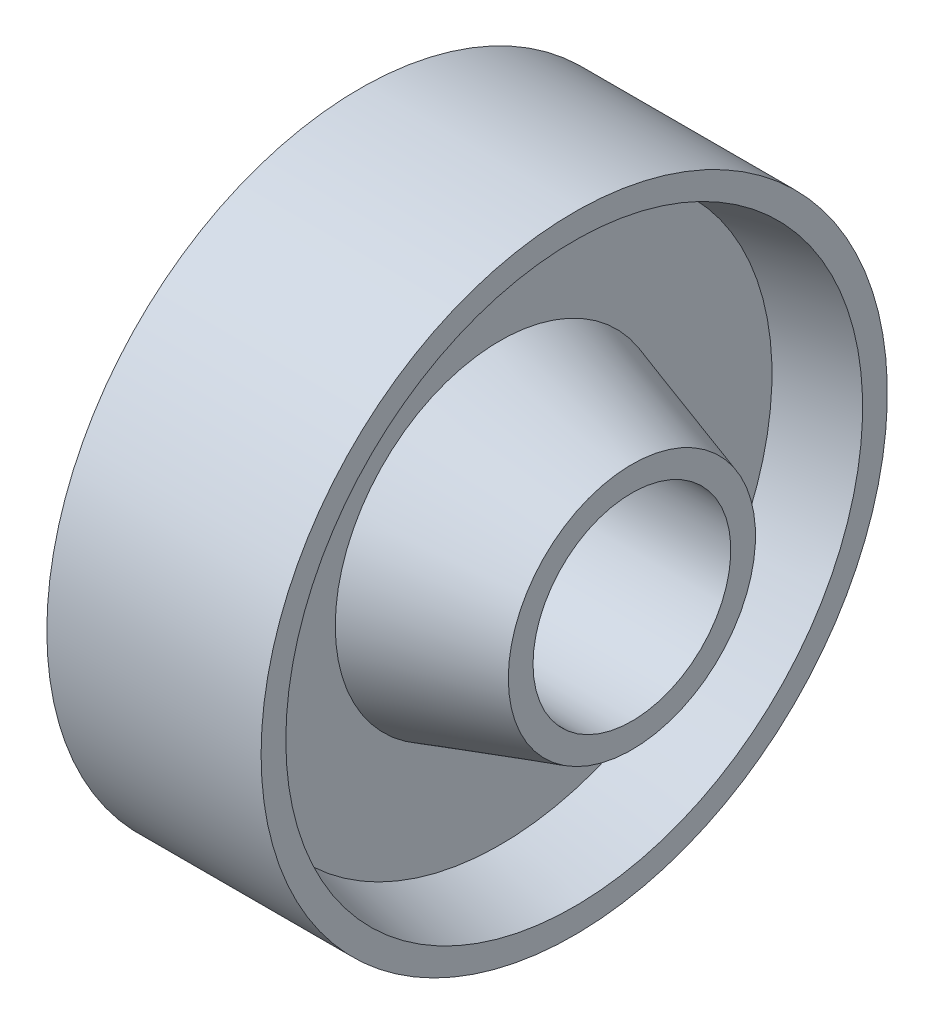
ISO-10303-21;
HEADER;
FILE_DESCRIPTION(('STEP AP214'),'2;1');
FILE_NAME('part.step','',(''),(''),'','','');
FILE_SCHEMA(('AUTOMOTIVE_DESIGN { 1 0 10303 214 1 1 1 1 }'));
ENDSEC;
DATA;
#1=APPLICATION_CONTEXT('core data for automotive mechanical design processes');
#2=APPLICATION_PROTOCOL_DEFINITION('international standard','automotive_design',2000,#1);
#3=PRODUCT_CONTEXT('',#1,'mechanical');
#4=PRODUCT('Part','Part','',(#3));
#5=PRODUCT_RELATED_PRODUCT_CATEGORY('part','',(#4));
#6=PRODUCT_DEFINITION_FORMATION('','',#4);
#7=PRODUCT_DEFINITION_CONTEXT('part definition',#1,'design');
#8=PRODUCT_DEFINITION('design','',#6,#7);
#9=PRODUCT_DEFINITION_SHAPE('','',#8);
#10=(LENGTH_UNIT() NAMED_UNIT(*) SI_UNIT(.MILLI.,.METRE.));
#11=(NAMED_UNIT(*) PLANE_ANGLE_UNIT() SI_UNIT($,.RADIAN.));
#12=(NAMED_UNIT(*) SI_UNIT($,.STERADIAN.) SOLID_ANGLE_UNIT());
#13=UNCERTAINTY_MEASURE_WITH_UNIT(LENGTH_MEASURE(1.E-05),#10,'distance_accuracy_value','');
#14=(GEOMETRIC_REPRESENTATION_CONTEXT(3) GLOBAL_UNCERTAINTY_ASSIGNED_CONTEXT((#13)) GLOBAL_UNIT_ASSIGNED_CONTEXT((#10,
#11,#12)) REPRESENTATION_CONTEXT('',''));
#15=CARTESIAN_POINT('',(0.,0.,0.));
#16=DIRECTION('',(0.,0.,1.));
#17=DIRECTION('',(1.,0.,0.));
#18=AXIS2_PLACEMENT_3D('',#15,#16,#17);
#19=CARTESIAN_POINT('',(-13.,38.,0.));
#20=DIRECTION('',(1.,0.,0.));
#21=DIRECTION('',(0.,0.,-1.));
#22=AXIS2_PLACEMENT_3D('',#19,#20,#21);
#23=PLANE('',#22);
#24=CARTESIAN_POINT('',(-13.,0.,0.));
#25=DIRECTION('',(-1.,0.,0.));
#26=DIRECTION('',(0.,0.,1.));
#27=AXIS2_PLACEMENT_3D('',#24,#25,#26);
#28=CIRCLE('',#27,35.);
#29=CARTESIAN_POINT('',(-13.,0.,35.));
#30=VERTEX_POINT('',#29);
#31=EDGE_CURVE('E12',#30,#30,#28,.T.);
#32=ORIENTED_EDGE('',*,*,#31,.F.);
#33=EDGE_LOOP('',(#32));
#34=FACE_BOUND('',#33,.T.);
#35=CARTESIAN_POINT('',(-13.,0.,0.));
#36=DIRECTION('',(-1.,0.,0.));
#37=DIRECTION('',(0.,0.,1.));
#38=AXIS2_PLACEMENT_3D('',#35,#36,#37);
#39=CIRCLE('',#38,38.);
#40=CARTESIAN_POINT('',(-13.,0.,38.));
#41=VERTEX_POINT('',#40);
#42=EDGE_CURVE('E91',#41,#41,#39,.T.);
#43=ORIENTED_EDGE('',*,*,#42,.T.);
#44=EDGE_LOOP('',(#43));
#45=FACE_BOUND('',#44,.T.);
#46=ADVANCED_FACE('F51',(#34,#45),#23,.F.);
#47=CARTESIAN_POINT('',(-13.,0.,0.));
#48=DIRECTION('',(-1.,0.,0.));
#49=DIRECTION('',(0.,0.,1.));
#50=AXIS2_PLACEMENT_3D('',#47,#48,#49);
#51=CONICAL_SURFACE('',#50,35.,0.218668945873942);
#52=CARTESIAN_POINT('',(-4.,0.,0.));
#53=DIRECTION('',(-1.,0.,0.));
#54=DIRECTION('',(0.,0.,1.));
#55=AXIS2_PLACEMENT_3D('',#52,#53,#54);
#56=CIRCLE('',#55,33.);
#57=CARTESIAN_POINT('',(-4.,0.,33.));
#58=VERTEX_POINT('',#57);
#59=EDGE_CURVE('E57',#58,#58,#56,.T.);
#60=ORIENTED_EDGE('',*,*,#59,.F.);
#61=EDGE_LOOP('',(#60));
#62=FACE_BOUND('',#61,.T.);
#63=ORIENTED_EDGE('',*,*,#31,.T.);
#64=EDGE_LOOP('',(#63));
#65=FACE_BOUND('',#64,.T.);
#66=ADVANCED_FACE('F152',(#62,#65),#51,.F.);
#67=CARTESIAN_POINT('',(-4.,33.,0.));
#68=DIRECTION('',(1.,0.,0.));
#69=DIRECTION('',(0.,0.,-1.));
#70=AXIS2_PLACEMENT_3D('',#67,#68,#69);
#71=PLANE('',#70);
#72=CARTESIAN_POINT('',(-4.,0.,0.));
#73=DIRECTION('',(-1.,0.,0.));
#74=DIRECTION('',(0.,0.,1.));
#75=AXIS2_PLACEMENT_3D('',#72,#73,#74);
#76=CIRCLE('',#75,20.);
#77=CARTESIAN_POINT('',(-4.,0.,20.));
#78=VERTEX_POINT('',#77);
#79=EDGE_CURVE('E61',#78,#78,#76,.T.);
#80=ORIENTED_EDGE('',*,*,#79,.F.);
#81=EDGE_LOOP('',(#80));
#82=FACE_BOUND('',#81,.T.);
#83=ORIENTED_EDGE('',*,*,#59,.T.);
#84=EDGE_LOOP('',(#83));
#85=FACE_BOUND('',#84,.T.);
#86=ADVANCED_FACE('F147',(#82,#85),#71,.F.);
#87=CARTESIAN_POINT('',(-4.,0.,0.));
#88=DIRECTION('',(1.,0.,0.));
#89=DIRECTION('',(0.,0.,-1.));
#90=AXIS2_PLACEMENT_3D('',#87,#88,#89);
#91=CONICAL_SURFACE('',#90,20.,0.302884868374971);
#92=CARTESIAN_POINT('',(-20.,0.,0.));
#93=DIRECTION('',(-1.,0.,0.));
#94=DIRECTION('',(0.,0.,1.));
#95=AXIS2_PLACEMENT_3D('',#92,#93,#94);
#96=CIRCLE('',#95,15.);
#97=CARTESIAN_POINT('',(-20.,0.,15.));
#98=VERTEX_POINT('',#97);
#99=EDGE_CURVE('E65',#98,#98,#96,.T.);
#100=ORIENTED_EDGE('',*,*,#99,.F.);
#101=EDGE_LOOP('',(#100));
#102=FACE_BOUND('',#101,.T.);
#103=ORIENTED_EDGE('',*,*,#79,.T.);
#104=EDGE_LOOP('',(#103));
#105=FACE_BOUND('',#104,.T.);
#106=ADVANCED_FACE('F141',(#102,#105),#91,.T.);
#107=CARTESIAN_POINT('',(-20.,15.,0.));
#108=DIRECTION('',(1.,0.,0.));
#109=DIRECTION('',(0.,0.,-1.));
#110=AXIS2_PLACEMENT_3D('',#107,#108,#109);
#111=PLANE('',#110);
#112=CARTESIAN_POINT('',(-20.,0.,0.));
#113=DIRECTION('',(-1.,0.,0.));
#114=DIRECTION('',(0.,0.,1.));
#115=AXIS2_PLACEMENT_3D('',#112,#113,#114);
#116=CIRCLE('',#115,12.);
#117=CARTESIAN_POINT('',(-20.,0.,12.));
#118=VERTEX_POINT('',#117);
#119=EDGE_CURVE('E70',#118,#118,#116,.T.);
#120=ORIENTED_EDGE('',*,*,#119,.F.);
#121=EDGE_LOOP('',(#120));
#122=FACE_BOUND('',#121,.T.);
#123=ORIENTED_EDGE('',*,*,#99,.T.);
#124=EDGE_LOOP('',(#123));
#125=FACE_BOUND('',#124,.T.);
#126=ADVANCED_FACE('F135',(#122,#125),#111,.F.);
#127=CARTESIAN_POINT('',(-72.5375854214123,0.,0.));
#128=DIRECTION('',(-1.,0.,0.));
#129=DIRECTION('',(0.,0.,1.));
#130=AXIS2_PLACEMENT_3D('',#127,#128,#129);
#131=CYLINDRICAL_SURFACE('',#130,12.0000000000001);
#132=CARTESIAN_POINT('',(19.9999999999999,0.,0.));
#133=DIRECTION('',(-1.,0.,0.));
#134=DIRECTION('',(0.,0.,1.));
#135=AXIS2_PLACEMENT_3D('',#132,#133,#134);
#136=CIRCLE('',#135,12.0000000000001);
#137=CARTESIAN_POINT('',(19.9999999999999,0.,12.0000000000002));
#138=VERTEX_POINT('',#137);
#139=EDGE_CURVE('E73',#138,#138,#136,.T.);
#140=ORIENTED_EDGE('',*,*,#139,.F.);
#141=EDGE_LOOP('',(#140));
#142=FACE_BOUND('',#141,.T.);
#143=ORIENTED_EDGE('',*,*,#119,.T.);
#144=EDGE_LOOP('',(#143));
#145=FACE_BOUND('',#144,.T.);
#146=ADVANCED_FACE('F129',(#142,#145),#131,.F.);
#147=CARTESIAN_POINT('',(19.9999999999999,15.0000000000002,0.));
#148=DIRECTION('',(-1.,0.,0.));
#149=DIRECTION('',(0.,0.,1.));
#150=AXIS2_PLACEMENT_3D('',#147,#148,#149);
#151=PLANE('',#150);
#152=CARTESIAN_POINT('',(19.9999999999999,0.,0.));
#153=DIRECTION('',(-1.,0.,0.));
#154=DIRECTION('',(0.,0.,1.));
#155=AXIS2_PLACEMENT_3D('',#152,#153,#154);
#156=CIRCLE('',#155,15.0000000000001);
#157=CARTESIAN_POINT('',(19.9999999999999,0.,15.0000000000002));
#158=VERTEX_POINT('',#157);
#159=EDGE_CURVE('E76',#158,#158,#156,.T.);
#160=ORIENTED_EDGE('',*,*,#159,.F.);
#161=EDGE_LOOP('',(#160));
#162=FACE_BOUND('',#161,.T.);
#163=ORIENTED_EDGE('',*,*,#139,.T.);
#164=EDGE_LOOP('',(#163));
#165=FACE_BOUND('',#164,.T.);
#166=ADVANCED_FACE('F123',(#162,#165),#151,.F.);
#167=CARTESIAN_POINT('',(19.9999999999999,0.,0.));
#168=DIRECTION('',(-1.,0.,0.));
#169=DIRECTION('',(0.,0.,1.));
#170=AXIS2_PLACEMENT_3D('',#167,#168,#169);
#171=CONICAL_SURFACE('',#170,15.0000000000001,0.302884868374964);
#172=CARTESIAN_POINT('',(3.99999999999986,0.,0.));
#173=DIRECTION('',(-1.,0.,0.));
#174=DIRECTION('',(0.,0.,1.));
#175=AXIS2_PLACEMENT_3D('',#172,#173,#174);
#176=CIRCLE('',#175,20.);
#177=CARTESIAN_POINT('',(3.99999999999986,0.,20.));
#178=VERTEX_POINT('',#177);
#179=EDGE_CURVE('E79',#178,#178,#176,.T.);
#180=ORIENTED_EDGE('',*,*,#179,.F.);
#181=EDGE_LOOP('',(#180));
#182=FACE_BOUND('',#181,.T.);
#183=ORIENTED_EDGE('',*,*,#159,.T.);
#184=EDGE_LOOP('',(#183));
#185=FACE_BOUND('',#184,.T.);
#186=ADVANCED_FACE('F117',(#182,#185),#171,.T.);
#187=CARTESIAN_POINT('',(3.99999999999984,33.,0.));
#188=DIRECTION('',(-1.,0.,0.));
#189=DIRECTION('',(0.,0.,1.));
#190=AXIS2_PLACEMENT_3D('',#187,#188,#189);
#191=PLANE('',#190);
#192=CARTESIAN_POINT('',(3.99999999999978,0.,0.));
#193=DIRECTION('',(-1.,0.,0.));
#194=DIRECTION('',(0.,0.,1.));
#195=AXIS2_PLACEMENT_3D('',#192,#193,#194);
#196=CIRCLE('',#195,33.);
#197=CARTESIAN_POINT('',(3.99999999999978,0.,33.0000000000001));
#198=VERTEX_POINT('',#197);
#199=EDGE_CURVE('E82',#198,#198,#196,.T.);
#200=ORIENTED_EDGE('',*,*,#199,.F.);
#201=EDGE_LOOP('',(#200));
#202=FACE_BOUND('',#201,.T.);
#203=ORIENTED_EDGE('',*,*,#179,.T.);
#204=EDGE_LOOP('',(#203));
#205=FACE_BOUND('',#204,.T.);
#206=ADVANCED_FACE('F111',(#202,#205),#191,.F.);
#207=CARTESIAN_POINT('',(3.99999999999978,0.,0.));
#208=DIRECTION('',(1.,0.,0.));
#209=DIRECTION('',(0.,0.,-1.));
#210=AXIS2_PLACEMENT_3D('',#207,#208,#209);
#211=CONICAL_SURFACE('',#210,33.,0.218668945873948);
#212=CARTESIAN_POINT('',(12.9999999999998,0.,0.));
#213=DIRECTION('',(-1.,0.,0.));
#214=DIRECTION('',(0.,0.,1.));
#215=AXIS2_PLACEMENT_3D('',#212,#213,#214);
#216=CIRCLE('',#215,35.0000000000001);
#217=CARTESIAN_POINT('',(12.9999999999998,0.,35.0000000000001));
#218=VERTEX_POINT('',#217);
#219=EDGE_CURVE('E85',#218,#218,#216,.T.);
#220=ORIENTED_EDGE('',*,*,#219,.F.);
#221=EDGE_LOOP('',(#220));
#222=FACE_BOUND('',#221,.T.);
#223=ORIENTED_EDGE('',*,*,#199,.T.);
#224=EDGE_LOOP('',(#223));
#225=FACE_BOUND('',#224,.T.);
#226=ADVANCED_FACE('F105',(#222,#225),#211,.F.);
#227=CARTESIAN_POINT('',(12.9999999999997,38.0000000000001,0.));
#228=DIRECTION('',(-1.,0.,0.));
#229=DIRECTION('',(0.,0.,1.));
#230=AXIS2_PLACEMENT_3D('',#227,#228,#229);
#231=PLANE('',#230);
#232=CARTESIAN_POINT('',(12.9999999999997,0.,0.));
#233=DIRECTION('',(-1.,0.,0.));
#234=DIRECTION('',(0.,0.,1.));
#235=AXIS2_PLACEMENT_3D('',#232,#233,#234);
#236=CIRCLE('',#235,38.0000000000001);
#237=CARTESIAN_POINT('',(12.9999999999997,0.,38.0000000000001));
#238=VERTEX_POINT('',#237);
#239=EDGE_CURVE('E88',#238,#238,#236,.T.);
#240=ORIENTED_EDGE('',*,*,#239,.F.);
#241=EDGE_LOOP('',(#240));
#242=FACE_BOUND('',#241,.T.);
#243=ORIENTED_EDGE('',*,*,#219,.T.);
#244=EDGE_LOOP('',(#243));
#245=FACE_BOUND('',#244,.T.);
#246=ADVANCED_FACE('F99',(#242,#245),#231,.F.);
#247=CARTESIAN_POINT('',(-72.5375854214123,0.,0.));
#248=DIRECTION('',(-1.,0.,0.));
#249=DIRECTION('',(0.,0.,1.));
#250=AXIS2_PLACEMENT_3D('',#247,#248,#249);
#251=CYLINDRICAL_SURFACE('',#250,38.);
#252=ORIENTED_EDGE('',*,*,#42,.F.);
#253=EDGE_LOOP('',(#252));
#254=FACE_BOUND('',#253,.T.);
#255=ORIENTED_EDGE('',*,*,#239,.T.);
#256=EDGE_LOOP('',(#255));
#257=FACE_BOUND('',#256,.T.);
#258=ADVANCED_FACE('F96',(#254,#257),#251,.T.);
#259=CLOSED_SHELL('',(#46,#66,#86,#106,#126,#146,#166,#186,#206,#226,#246,#258));
#260=MANIFOLD_SOLID_BREP('B2',#259);
#261=ADVANCED_BREP_SHAPE_REPRESENTATION('',(#18,#260),#14);
#262=SHAPE_DEFINITION_REPRESENTATION(#9,#261);
ENDSEC;
END-ISO-10303-21;
